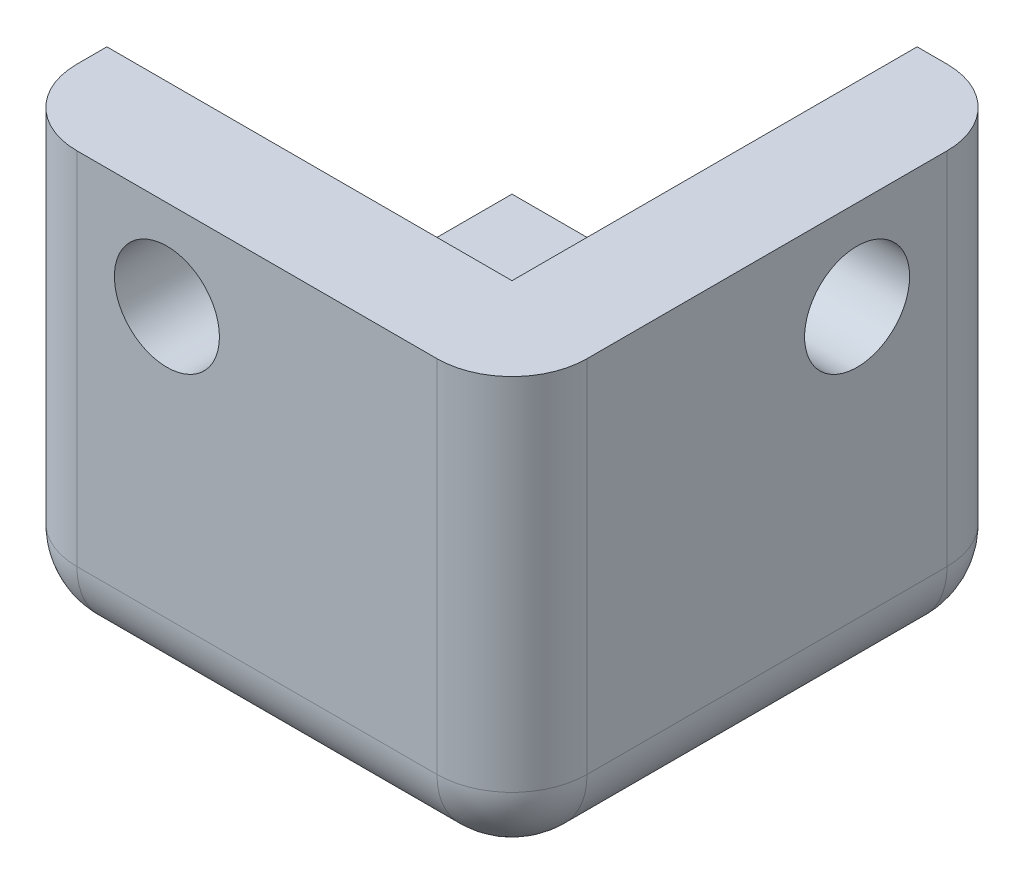
ISO-10303-21;
HEADER;
FILE_DESCRIPTION(('STEP AP214'),'2;1');
FILE_NAME('part.step','',(''),(''),'','','');
FILE_SCHEMA(('AUTOMOTIVE_DESIGN { 1 0 10303 214 1 1 1 1 }'));
ENDSEC;
DATA;
#1=APPLICATION_CONTEXT('core data for automotive mechanical design processes');
#2=APPLICATION_PROTOCOL_DEFINITION('international standard','automotive_design',2000,#1);
#3=PRODUCT_CONTEXT('',#1,'mechanical');
#4=PRODUCT('Part','Part','',(#3));
#5=PRODUCT_RELATED_PRODUCT_CATEGORY('part','',(#4));
#6=PRODUCT_DEFINITION_FORMATION('','',#4);
#7=PRODUCT_DEFINITION_CONTEXT('part definition',#1,'design');
#8=PRODUCT_DEFINITION('design','',#6,#7);
#9=PRODUCT_DEFINITION_SHAPE('','',#8);
#10=(LENGTH_UNIT() NAMED_UNIT(*) SI_UNIT(.MILLI.,.METRE.));
#11=(NAMED_UNIT(*) PLANE_ANGLE_UNIT() SI_UNIT($,.RADIAN.));
#12=(NAMED_UNIT(*) SI_UNIT($,.STERADIAN.) SOLID_ANGLE_UNIT());
#13=UNCERTAINTY_MEASURE_WITH_UNIT(LENGTH_MEASURE(1.E-05),#10,'distance_accuracy_value','');
#14=(GEOMETRIC_REPRESENTATION_CONTEXT(3) GLOBAL_UNCERTAINTY_ASSIGNED_CONTEXT((#13)) GLOBAL_UNIT_ASSIGNED_CONTEXT((#10,
#11,#12)) REPRESENTATION_CONTEXT('',''));
#15=CARTESIAN_POINT('',(0.,0.,0.));
#16=DIRECTION('',(0.,0.,1.));
#17=DIRECTION('',(1.,0.,0.));
#18=AXIS2_PLACEMENT_3D('',#15,#16,#17);
#19=CARTESIAN_POINT('',(0.,22.,0.));
#20=DIRECTION('',(1.,0.,0.));
#21=DIRECTION('',(0.,0.,-1.));
#22=AXIS2_PLACEMENT_3D('',#19,#20,#21);
#23=PLANE('',#22);
#24=DIRECTION('',(0.,1.,0.));
#25=VECTOR('',#24,1.);
#26=CARTESIAN_POINT('',(0.,-7.,-27.));
#27=LINE('',#26,#25);
#28=CARTESIAN_POINT('',(0.,-2.,-27.));
#29=VERTEX_POINT('',#28);
#30=CARTESIAN_POINT('',(0.,0.,-27.));
#31=VERTEX_POINT('',#30);
#32=EDGE_CURVE('E126',#29,#31,#27,.T.);
#33=ORIENTED_EDGE('',*,*,#32,.F.);
#34=DIRECTION('',(0.,0.,-1.));
#35=VECTOR('',#34,1.);
#36=CARTESIAN_POINT('',(0.,-2.,0.));
#37=LINE('',#36,#35);
#38=CARTESIAN_POINT('',(0.,-2.,2.));
#39=VERTEX_POINT('',#38);
#40=EDGE_CURVE('E11',#29,#39,#37,.F.);
#41=ORIENTED_EDGE('',*,*,#40,.T.);
#42=DIRECTION('',(0.,-1.,0.));
#43=VECTOR('',#42,1.);
#44=CARTESIAN_POINT('',(0.,22.,2.));
#45=LINE('',#44,#43);
#46=CARTESIAN_POINT('',(0.,22.,2.));
#47=VERTEX_POINT('',#46);
#48=EDGE_CURVE('E201',#39,#47,#45,.F.);
#49=ORIENTED_EDGE('',*,*,#48,.T.);
#50=DIRECTION('',(0.,0.,1.));
#51=VECTOR('',#50,1.);
#52=CARTESIAN_POINT('',(0.,22.,0.));
#53=LINE('',#52,#51);
#54=CARTESIAN_POINT('',(0.,22.,0.));
#55=VERTEX_POINT('',#54);
#56=EDGE_CURVE('E151',#55,#47,#53,.T.);
#57=ORIENTED_EDGE('',*,*,#56,.F.);
#58=DIRECTION('',(0.,-1.,0.));
#59=VECTOR('',#58,1.);
#60=CARTESIAN_POINT('',(0.,22.,0.));
#61=LINE('',#60,#59);
#62=CARTESIAN_POINT('',(0.,0.,0.));
#63=VERTEX_POINT('',#62);
#64=EDGE_CURVE('E141',#55,#63,#61,.T.);
#65=ORIENTED_EDGE('',*,*,#64,.T.);
#66=DIRECTION('',(0.,0.,-1.));
#67=VECTOR('',#66,1.);
#68=CARTESIAN_POINT('',(0.,0.,7.));
#69=LINE('',#68,#67);
#70=EDGE_CURVE('E138',#63,#31,#69,.T.);
#71=ORIENTED_EDGE('',*,*,#70,.T.);
#72=EDGE_LOOP('',(#33,#41,#49,#57,#65,#71));
#73=FACE_BOUND('',#72,.T.);
#74=ADVANCED_FACE('F37',(#73),#23,.F.);
#75=CARTESIAN_POINT('',(0.,22.,7.));
#76=DIRECTION('',(0.,0.,-1.));
#77=DIRECTION('',(-1.,0.,0.));
#78=AXIS2_PLACEMENT_3D('',#75,#76,#77);
#79=PLANE('',#78);
#80=CARTESIAN_POINT('',(11.,16.,7.));
#81=DIRECTION('',(0.,0.,1.));
#82=DIRECTION('',(1.,0.,0.));
#83=AXIS2_PLACEMENT_3D('',#80,#81,#82);
#84=CIRCLE('',#83,3.5);
#85=CARTESIAN_POINT('',(14.5,16.,7.));
#86=VERTEX_POINT('',#85);
#87=EDGE_CURVE('E221',#86,#86,#84,.T.);
#88=ORIENTED_EDGE('',*,*,#87,.F.);
#89=EDGE_LOOP('',(#88));
#90=FACE_BOUND('',#89,.T.);
#91=DIRECTION('',(1.,0.,0.));
#92=VECTOR('',#91,1.);
#93=CARTESIAN_POINT('',(0.,22.,7.));
#94=LINE('',#93,#92);
#95=CARTESIAN_POINT('',(5.,22.,7.));
#96=VERTEX_POINT('',#95);
#97=CARTESIAN_POINT('',(29.,22.,7.));
#98=VERTEX_POINT('',#97);
#99=EDGE_CURVE('E154',#96,#98,#94,.T.);
#100=ORIENTED_EDGE('',*,*,#99,.F.);
#101=DIRECTION('',(0.,-1.,0.));
#102=VECTOR('',#101,1.);
#103=CARTESIAN_POINT('',(5.,22.,7.));
#104=LINE('',#103,#102);
#105=CARTESIAN_POINT('',(5.,-2.,7.));
#106=VERTEX_POINT('',#105);
#107=EDGE_CURVE('E183',#96,#106,#104,.T.);
#108=ORIENTED_EDGE('',*,*,#107,.T.);
#109=DIRECTION('',(-1.,0.,0.));
#110=VECTOR('',#109,1.);
#111=CARTESIAN_POINT('',(0.,-2.,7.));
#112=LINE('',#111,#110);
#113=CARTESIAN_POINT('',(29.,-2.,7.));
#114=VERTEX_POINT('',#113);
#115=EDGE_CURVE('E181',#106,#114,#112,.F.);
#116=ORIENTED_EDGE('',*,*,#115,.T.);
#117=DIRECTION('',(0.,-1.,0.));
#118=VECTOR('',#117,1.);
#119=CARTESIAN_POINT('',(29.,22.,7.));
#120=LINE('',#119,#118);
#121=EDGE_CURVE('E179',#114,#98,#120,.F.);
#122=ORIENTED_EDGE('',*,*,#121,.T.);
#123=EDGE_LOOP('',(#100,#108,#116,#122));
#124=FACE_BOUND('',#123,.T.);
#125=ADVANCED_FACE('F265',(#90,#124),#79,.F.);
#126=CARTESIAN_POINT('',(34.,22.,7.));
#127=DIRECTION('',(-1.,0.,0.));
#128=DIRECTION('',(0.,0.,1.));
#129=AXIS2_PLACEMENT_3D('',#126,#127,#128);
#130=PLANE('',#129);
#131=CARTESIAN_POINT('',(34.,16.,-16.));
#132=DIRECTION('',(1.,0.,0.));
#133=DIRECTION('',(0.,0.,-1.));
#134=AXIS2_PLACEMENT_3D('',#131,#132,#133);
#135=CIRCLE('',#134,3.5);
#136=CARTESIAN_POINT('',(34.,16.,-19.5));
#137=VERTEX_POINT('',#136);
#138=EDGE_CURVE('E216',#137,#137,#135,.T.);
#139=ORIENTED_EDGE('',*,*,#138,.F.);
#140=EDGE_LOOP('',(#139));
#141=FACE_BOUND('',#140,.T.);
#142=DIRECTION('',(0.,0.,1.));
#143=VECTOR('',#142,1.);
#144=CARTESIAN_POINT('',(34.,-2.,7.));
#145=LINE('',#144,#143);
#146=CARTESIAN_POINT('',(34.,-2.,2.));
#147=VERTEX_POINT('',#146);
#148=CARTESIAN_POINT('',(34.,-2.,-22.));
#149=VERTEX_POINT('',#148);
#150=EDGE_CURVE('E188',#147,#149,#145,.F.);
#151=ORIENTED_EDGE('',*,*,#150,.T.);
#152=DIRECTION('',(0.,-1.,0.));
#153=VECTOR('',#152,1.);
#154=CARTESIAN_POINT('',(34.,22.,-22.));
#155=LINE('',#154,#153);
#156=CARTESIAN_POINT('',(34.,22.,-22.));
#157=VERTEX_POINT('',#156);
#158=EDGE_CURVE('E191',#149,#157,#155,.F.);
#159=ORIENTED_EDGE('',*,*,#158,.T.);
#160=DIRECTION('',(0.,0.,-1.));
#161=VECTOR('',#160,1.);
#162=CARTESIAN_POINT('',(34.,22.,7.));
#163=LINE('',#162,#161);
#164=CARTESIAN_POINT('',(34.,22.,2.));
#165=VERTEX_POINT('',#164);
#166=EDGE_CURVE('E158',#165,#157,#163,.T.);
#167=ORIENTED_EDGE('',*,*,#166,.F.);
#168=DIRECTION('',(0.,-1.,0.));
#169=VECTOR('',#168,1.);
#170=CARTESIAN_POINT('',(34.,22.,2.));
#171=LINE('',#170,#169);
#172=EDGE_CURVE('E186',#165,#147,#171,.T.);
#173=ORIENTED_EDGE('',*,*,#172,.T.);
#174=EDGE_LOOP('',(#151,#159,#167,#173));
#175=FACE_BOUND('',#174,.T.);
#176=ADVANCED_FACE('F262',(#141,#175),#130,.F.);
#177=CARTESIAN_POINT('',(27.,22.,-27.));
#178=DIRECTION('',(0.,0.,1.));
#179=DIRECTION('',(1.,0.,0.));
#180=AXIS2_PLACEMENT_3D('',#177,#178,#179);
#181=PLANE('',#180);
#182=DIRECTION('',(0.,-1.,0.));
#183=VECTOR('',#182,1.);
#184=CARTESIAN_POINT('',(29.,22.,-27.));
#185=LINE('',#184,#183);
#186=CARTESIAN_POINT('',(29.,22.,-27.));
#187=VERTEX_POINT('',#186);
#188=CARTESIAN_POINT('',(29.,-2.,-27.));
#189=VERTEX_POINT('',#188);
#190=EDGE_CURVE('E193',#187,#189,#185,.T.);
#191=ORIENTED_EDGE('',*,*,#190,.T.);
#192=DIRECTION('',(1.,0.,0.));
#193=VECTOR('',#192,1.);
#194=CARTESIAN_POINT('',(27.,-2.,-27.));
#195=LINE('',#194,#193);
#196=EDGE_CURVE('E46',#189,#29,#195,.F.);
#197=ORIENTED_EDGE('',*,*,#196,.T.);
#198=ORIENTED_EDGE('',*,*,#32,.T.);
#199=DIRECTION('',(1.,0.,0.));
#200=VECTOR('',#199,1.);
#201=CARTESIAN_POINT('',(34.,0.,-27.));
#202=LINE('',#201,#200);
#203=CARTESIAN_POINT('',(27.,0.,-27.));
#204=VERTEX_POINT('',#203);
#205=EDGE_CURVE('E131',#31,#204,#202,.T.);
#206=ORIENTED_EDGE('',*,*,#205,.T.);
#207=DIRECTION('',(0.,-1.,0.));
#208=VECTOR('',#207,1.);
#209=CARTESIAN_POINT('',(27.,22.,-27.));
#210=LINE('',#209,#208);
#211=CARTESIAN_POINT('',(27.,22.,-27.));
#212=VERTEX_POINT('',#211);
#213=EDGE_CURVE('E173',#212,#204,#210,.T.);
#214=ORIENTED_EDGE('',*,*,#213,.F.);
#215=DIRECTION('',(-1.,0.,0.));
#216=VECTOR('',#215,1.);
#217=CARTESIAN_POINT('',(27.,22.,-27.));
#218=LINE('',#217,#216);
#219=EDGE_CURVE('E161',#187,#212,#218,.T.);
#220=ORIENTED_EDGE('',*,*,#219,.F.);
#221=EDGE_LOOP('',(#191,#197,#198,#206,#214,#220));
#222=FACE_BOUND('',#221,.T.);
#223=ADVANCED_FACE('F128',(#222),#181,.F.);
#224=CARTESIAN_POINT('',(27.,22.,0.));
#225=DIRECTION('',(1.,0.,0.));
#226=DIRECTION('',(0.,0.,-1.));
#227=AXIS2_PLACEMENT_3D('',#224,#225,#226);
#228=PLANE('',#227);
#229=CARTESIAN_POINT('',(27.,16.,-16.));
#230=DIRECTION('',(1.,0.,0.));
#231=DIRECTION('',(0.,0.,-1.));
#232=AXIS2_PLACEMENT_3D('',#229,#230,#231);
#233=CIRCLE('',#232,2.);
#234=CARTESIAN_POINT('',(27.,16.,-18.));
#235=VERTEX_POINT('',#234);
#236=EDGE_CURVE('E213',#235,#235,#233,.T.);
#237=ORIENTED_EDGE('',*,*,#236,.T.);
#238=EDGE_LOOP('',(#237));
#239=FACE_BOUND('',#238,.T.);
#240=DIRECTION('',(0.,0.,1.));
#241=VECTOR('',#240,1.);
#242=CARTESIAN_POINT('',(27.,0.,0.));
#243=LINE('',#242,#241);
#244=CARTESIAN_POINT('',(27.,0.,0.));
#245=VERTEX_POINT('',#244);
#246=EDGE_CURVE('E135',#204,#245,#243,.T.);
#247=ORIENTED_EDGE('',*,*,#246,.T.);
#248=DIRECTION('',(0.,-1.,0.));
#249=VECTOR('',#248,1.);
#250=CARTESIAN_POINT('',(27.,22.,0.));
#251=LINE('',#250,#249);
#252=CARTESIAN_POINT('',(27.,22.,0.));
#253=VERTEX_POINT('',#252);
#254=EDGE_CURVE('E170',#253,#245,#251,.T.);
#255=ORIENTED_EDGE('',*,*,#254,.F.);
#256=DIRECTION('',(0.,0.,1.));
#257=VECTOR('',#256,1.);
#258=CARTESIAN_POINT('',(27.,22.,0.));
#259=LINE('',#258,#257);
#260=EDGE_CURVE('E163',#212,#253,#259,.T.);
#261=ORIENTED_EDGE('',*,*,#260,.F.);
#262=ORIENTED_EDGE('',*,*,#213,.T.);
#263=EDGE_LOOP('',(#247,#255,#261,#262));
#264=FACE_BOUND('',#263,.T.);
#265=ADVANCED_FACE('F284',(#239,#264),#228,.F.);
#266=CARTESIAN_POINT('',(0.,22.,0.));
#267=DIRECTION('',(0.,0.,1.));
#268=DIRECTION('',(1.,0.,0.));
#269=AXIS2_PLACEMENT_3D('',#266,#267,#268);
#270=PLANE('',#269);
#271=CARTESIAN_POINT('',(11.,16.,0.));
#272=DIRECTION('',(0.,0.,1.));
#273=DIRECTION('',(1.,0.,0.));
#274=AXIS2_PLACEMENT_3D('',#271,#272,#273);
#275=CIRCLE('',#274,2.);
#276=CARTESIAN_POINT('',(13.,16.,0.));
#277=VERTEX_POINT('',#276);
#278=EDGE_CURVE('E218',#277,#277,#275,.T.);
#279=ORIENTED_EDGE('',*,*,#278,.T.);
#280=EDGE_LOOP('',(#279));
#281=FACE_BOUND('',#280,.T.);
#282=DIRECTION('',(-1.,0.,0.));
#283=VECTOR('',#282,1.);
#284=CARTESIAN_POINT('',(0.,0.,0.));
#285=LINE('',#284,#283);
#286=EDGE_CURVE('E155',#245,#63,#285,.T.);
#287=ORIENTED_EDGE('',*,*,#286,.T.);
#288=ORIENTED_EDGE('',*,*,#64,.F.);
#289=DIRECTION('',(-1.,0.,0.));
#290=VECTOR('',#289,1.);
#291=CARTESIAN_POINT('',(0.,22.,0.));
#292=LINE('',#291,#290);
#293=EDGE_CURVE('E165',#253,#55,#292,.T.);
#294=ORIENTED_EDGE('',*,*,#293,.F.);
#295=ORIENTED_EDGE('',*,*,#254,.T.);
#296=EDGE_LOOP('',(#287,#288,#294,#295));
#297=FACE_BOUND('',#296,.T.);
#298=ADVANCED_FACE('F288',(#281,#297),#270,.F.);
#299=CARTESIAN_POINT('',(0.,22.,0.));
#300=DIRECTION('',(0.,1.,0.));
#301=DIRECTION('',(0.,0.,1.));
#302=AXIS2_PLACEMENT_3D('',#299,#300,#301);
#303=PLANE('',#302);
#304=ORIENTED_EDGE('',*,*,#166,.T.);
#305=CARTESIAN_POINT('',(29.,22.,-22.));
#306=DIRECTION('',(0.,1.,0.));
#307=DIRECTION('',(0.,0.,1.));
#308=AXIS2_PLACEMENT_3D('',#305,#306,#307);
#309=CIRCLE('',#308,5.);
#310=EDGE_CURVE('E199',#157,#187,#309,.T.);
#311=ORIENTED_EDGE('',*,*,#310,.T.);
#312=ORIENTED_EDGE('',*,*,#219,.T.);
#313=ORIENTED_EDGE('',*,*,#260,.T.);
#314=ORIENTED_EDGE('',*,*,#293,.T.);
#315=ORIENTED_EDGE('',*,*,#56,.T.);
#316=CARTESIAN_POINT('',(5.,22.,2.));
#317=DIRECTION('',(0.,1.,0.));
#318=DIRECTION('',(0.,0.,1.));
#319=AXIS2_PLACEMENT_3D('',#316,#317,#318);
#320=CIRCLE('',#319,5.);
#321=EDGE_CURVE('E197',#47,#96,#320,.T.);
#322=ORIENTED_EDGE('',*,*,#321,.T.);
#323=ORIENTED_EDGE('',*,*,#99,.T.);
#324=CARTESIAN_POINT('',(29.,22.,2.));
#325=DIRECTION('',(0.,1.,0.));
#326=DIRECTION('',(0.,0.,1.));
#327=AXIS2_PLACEMENT_3D('',#324,#325,#326);
#328=CIRCLE('',#327,5.);
#329=EDGE_CURVE('E195',#98,#165,#328,.T.);
#330=ORIENTED_EDGE('',*,*,#329,.T.);
#331=EDGE_LOOP('',(#304,#311,#312,#313,#314,#315,#322,#323,#330));
#332=FACE_BOUND('',#331,.T.);
#333=ADVANCED_FACE('F280',(#332),#303,.T.);
#334=CARTESIAN_POINT('',(0.,0.,0.));
#335=DIRECTION('',(0.,1.,0.));
#336=DIRECTION('',(0.,0.,1.));
#337=AXIS2_PLACEMENT_3D('',#334,#335,#336);
#338=PLANE('',#337);
#339=ORIENTED_EDGE('',*,*,#286,.F.);
#340=ORIENTED_EDGE('',*,*,#246,.F.);
#341=ORIENTED_EDGE('',*,*,#205,.F.);
#342=ORIENTED_EDGE('',*,*,#70,.F.);
#343=EDGE_LOOP('',(#339,#340,#341,#342));
#344=FACE_BOUND('',#343,.T.);
#345=ADVANCED_FACE('F146',(#344),#338,.T.);
#346=CARTESIAN_POINT('',(0.,-7.,0.));
#347=DIRECTION('',(0.,1.,0.));
#348=DIRECTION('',(0.,0.,1.));
#349=AXIS2_PLACEMENT_3D('',#346,#347,#348);
#350=PLANE('',#349);
#351=DIRECTION('',(0.,0.,-1.));
#352=VECTOR('',#351,1.);
#353=CARTESIAN_POINT('',(5.,-7.,0.));
#354=LINE('',#353,#352);
#355=CARTESIAN_POINT('',(5.,-7.,2.));
#356=VERTEX_POINT('',#355);
#357=CARTESIAN_POINT('',(5.,-7.,-22.));
#358=VERTEX_POINT('',#357);
#359=EDGE_CURVE('E61',#356,#358,#354,.T.);
#360=ORIENTED_EDGE('',*,*,#359,.T.);
#361=DIRECTION('',(1.,0.,0.));
#362=VECTOR('',#361,1.);
#363=CARTESIAN_POINT('',(0.,-7.,-22.));
#364=LINE('',#363,#362);
#365=CARTESIAN_POINT('',(29.,-7.,-22.));
#366=VERTEX_POINT('',#365);
#367=EDGE_CURVE('E232',#358,#366,#364,.T.);
#368=ORIENTED_EDGE('',*,*,#367,.T.);
#369=DIRECTION('',(0.,0.,1.));
#370=VECTOR('',#369,1.);
#371=CARTESIAN_POINT('',(29.,-7.,0.));
#372=LINE('',#371,#370);
#373=CARTESIAN_POINT('',(29.,-7.,2.));
#374=VERTEX_POINT('',#373);
#375=EDGE_CURVE('E175',#366,#374,#372,.T.);
#376=ORIENTED_EDGE('',*,*,#375,.T.);
#377=DIRECTION('',(-1.,0.,0.));
#378=VECTOR('',#377,1.);
#379=CARTESIAN_POINT('',(0.,-7.,2.));
#380=LINE('',#379,#378);
#381=EDGE_CURVE('E177',#374,#356,#380,.T.);
#382=ORIENTED_EDGE('',*,*,#381,.T.);
#383=EDGE_LOOP('',(#360,#368,#376,#382));
#384=FACE_BOUND('',#383,.T.);
#385=ADVANCED_FACE('F300',(#384),#350,.F.);
#386=CARTESIAN_POINT('',(29.,22.,-22.));
#387=DIRECTION('',(0.,-1.,0.));
#388=DIRECTION('',(0.,0.,-1.));
#389=AXIS2_PLACEMENT_3D('',#386,#387,#388);
#390=CYLINDRICAL_SURFACE('',#389,5.);
#391=ORIENTED_EDGE('',*,*,#158,.F.);
#392=CARTESIAN_POINT('',(29.,-2.,-22.));
#393=DIRECTION('',(0.,-1.,0.));
#394=DIRECTION('',(0.,0.,-1.));
#395=AXIS2_PLACEMENT_3D('',#392,#393,#394);
#396=CIRCLE('',#395,5.);
#397=EDGE_CURVE('E225',#149,#189,#396,.F.);
#398=ORIENTED_EDGE('',*,*,#397,.T.);
#399=ORIENTED_EDGE('',*,*,#190,.F.);
#400=ORIENTED_EDGE('',*,*,#310,.F.);
#401=EDGE_LOOP('',(#391,#398,#399,#400));
#402=FACE_BOUND('',#401,.T.);
#403=ADVANCED_FACE('F276',(#402),#390,.T.);
#404=CARTESIAN_POINT('',(29.,22.,2.));
#405=DIRECTION('',(0.,-1.,0.));
#406=DIRECTION('',(0.,0.,-1.));
#407=AXIS2_PLACEMENT_3D('',#404,#405,#406);
#408=CYLINDRICAL_SURFACE('',#407,5.);
#409=ORIENTED_EDGE('',*,*,#329,.F.);
#410=ORIENTED_EDGE('',*,*,#121,.F.);
#411=CARTESIAN_POINT('',(29.,-2.,2.));
#412=DIRECTION('',(0.,-1.,0.));
#413=DIRECTION('',(0.,0.,-1.));
#414=AXIS2_PLACEMENT_3D('',#411,#412,#413);
#415=CIRCLE('',#414,5.);
#416=EDGE_CURVE('E144',#147,#114,#415,.T.);
#417=ORIENTED_EDGE('',*,*,#416,.F.);
#418=ORIENTED_EDGE('',*,*,#172,.F.);
#419=EDGE_LOOP('',(#409,#410,#417,#418));
#420=FACE_BOUND('',#419,.T.);
#421=ADVANCED_FACE('F310',(#420),#408,.T.);
#422=CARTESIAN_POINT('',(29.,-2.,0.));
#423=DIRECTION('',(0.,0.,1.));
#424=DIRECTION('',(1.,0.,0.));
#425=AXIS2_PLACEMENT_3D('',#422,#423,#424);
#426=CYLINDRICAL_SURFACE('',#425,5.);
#427=ORIENTED_EDGE('',*,*,#375,.F.);
#428=CARTESIAN_POINT('',(29.,-2.,-22.));
#429=DIRECTION('',(0.,0.,1.));
#430=DIRECTION('',(1.,0.,0.));
#431=AXIS2_PLACEMENT_3D('',#428,#429,#430);
#432=CIRCLE('',#431,5.);
#433=EDGE_CURVE('E203',#366,#149,#432,.T.);
#434=ORIENTED_EDGE('',*,*,#433,.T.);
#435=ORIENTED_EDGE('',*,*,#150,.F.);
#436=CARTESIAN_POINT('',(29.,-2.,2.));
#437=DIRECTION('',(0.,0.,1.));
#438=DIRECTION('',(1.,0.,0.));
#439=AXIS2_PLACEMENT_3D('',#436,#437,#438);
#440=CIRCLE('',#439,5.);
#441=EDGE_CURVE('E207',#374,#147,#440,.T.);
#442=ORIENTED_EDGE('',*,*,#441,.F.);
#443=EDGE_LOOP('',(#427,#434,#435,#442));
#444=FACE_BOUND('',#443,.T.);
#445=ADVANCED_FACE('F304',(#444),#426,.T.);
#446=CARTESIAN_POINT('',(29.,-2.,2.));
#447=DIRECTION('',(0.,0.,1.));
#448=DIRECTION('',(1.,0.,0.));
#449=AXIS2_PLACEMENT_3D('',#446,#447,#448);
#450=SPHERICAL_SURFACE('',#449,5.);
#451=ORIENTED_EDGE('',*,*,#441,.T.);
#452=ORIENTED_EDGE('',*,*,#416,.T.);
#453=CARTESIAN_POINT('',(29.,-2.,2.));
#454=DIRECTION('',(1.,0.,0.));
#455=DIRECTION('',(0.,0.,-1.));
#456=AXIS2_PLACEMENT_3D('',#453,#454,#455);
#457=CIRCLE('',#456,5.);
#458=EDGE_CURVE('E204',#374,#114,#457,.F.);
#459=ORIENTED_EDGE('',*,*,#458,.F.);
#460=EDGE_LOOP('',(#451,#452,#459));
#461=FACE_BOUND('',#460,.T.);
#462=ADVANCED_FACE('F306',(#461),#450,.T.);
#463=CARTESIAN_POINT('',(5.,22.,2.));
#464=DIRECTION('',(0.,-1.,0.));
#465=DIRECTION('',(0.,0.,-1.));
#466=AXIS2_PLACEMENT_3D('',#463,#464,#465);
#467=CYLINDRICAL_SURFACE('',#466,5.);
#468=ORIENTED_EDGE('',*,*,#48,.F.);
#469=CARTESIAN_POINT('',(5.,-2.,2.));
#470=DIRECTION('',(0.,-1.,0.));
#471=DIRECTION('',(0.,0.,-1.));
#472=AXIS2_PLACEMENT_3D('',#469,#470,#471);
#473=CIRCLE('',#472,5.);
#474=EDGE_CURVE('E229',#39,#106,#473,.F.);
#475=ORIENTED_EDGE('',*,*,#474,.T.);
#476=ORIENTED_EDGE('',*,*,#107,.F.);
#477=ORIENTED_EDGE('',*,*,#321,.F.);
#478=EDGE_LOOP('',(#468,#475,#476,#477));
#479=FACE_BOUND('',#478,.T.);
#480=ADVANCED_FACE('F292',(#479),#467,.T.);
#481=CARTESIAN_POINT('',(0.,-2.,2.));
#482=DIRECTION('',(-1.,0.,0.));
#483=DIRECTION('',(0.,0.,1.));
#484=AXIS2_PLACEMENT_3D('',#481,#482,#483);
#485=CYLINDRICAL_SURFACE('',#484,5.);
#486=ORIENTED_EDGE('',*,*,#115,.F.);
#487=CARTESIAN_POINT('',(5.,-2.,2.));
#488=DIRECTION('',(-1.,0.,0.));
#489=DIRECTION('',(0.,0.,1.));
#490=AXIS2_PLACEMENT_3D('',#487,#488,#489);
#491=CIRCLE('',#490,5.);
#492=EDGE_CURVE('E227',#106,#356,#491,.F.);
#493=ORIENTED_EDGE('',*,*,#492,.T.);
#494=ORIENTED_EDGE('',*,*,#381,.F.);
#495=ORIENTED_EDGE('',*,*,#458,.T.);
#496=EDGE_LOOP('',(#486,#493,#494,#495));
#497=FACE_BOUND('',#496,.T.);
#498=ADVANCED_FACE('F299',(#497),#485,.T.);
#499=CARTESIAN_POINT('',(29.,16.,-16.));
#500=DIRECTION('',(1.,0.,0.));
#501=DIRECTION('',(0.,0.,-1.));
#502=AXIS2_PLACEMENT_3D('',#499,#500,#501);
#503=CYLINDRICAL_SURFACE('',#502,3.5);
#504=CARTESIAN_POINT('',(29.,16.,-16.));
#505=DIRECTION('',(1.,0.,0.));
#506=DIRECTION('',(0.,0.,-1.));
#507=AXIS2_PLACEMENT_3D('',#504,#505,#506);
#508=CIRCLE('',#507,3.5);
#509=CARTESIAN_POINT('',(29.,16.,-19.5));
#510=VERTEX_POINT('',#509);
#511=EDGE_CURVE('E208',#510,#510,#508,.T.);
#512=ORIENTED_EDGE('',*,*,#511,.F.);
#513=EDGE_LOOP('',(#512));
#514=FACE_BOUND('',#513,.T.);
#515=ORIENTED_EDGE('',*,*,#138,.T.);
#516=EDGE_LOOP('',(#515));
#517=FACE_BOUND('',#516,.T.);
#518=ADVANCED_FACE('F260',(#514,#517),#503,.F.);
#519=CARTESIAN_POINT('',(29.,16.,-16.));
#520=DIRECTION('',(1.,0.,0.));
#521=DIRECTION('',(0.,0.,-1.));
#522=AXIS2_PLACEMENT_3D('',#519,#520,#521);
#523=PLANE('',#522);
#524=CARTESIAN_POINT('',(29.,16.,-16.));
#525=DIRECTION('',(1.,0.,0.));
#526=DIRECTION('',(0.,0.,-1.));
#527=AXIS2_PLACEMENT_3D('',#524,#525,#526);
#528=CIRCLE('',#527,2.);
#529=CARTESIAN_POINT('',(29.,16.,-18.));
#530=VERTEX_POINT('',#529);
#531=EDGE_CURVE('E217',#530,#530,#528,.T.);
#532=ORIENTED_EDGE('',*,*,#531,.F.);
#533=EDGE_LOOP('',(#532));
#534=FACE_BOUND('',#533,.T.);
#535=ORIENTED_EDGE('',*,*,#511,.T.);
#536=EDGE_LOOP('',(#535));
#537=FACE_BOUND('',#536,.T.);
#538=ADVANCED_FACE('F366',(#534,#537),#523,.T.);
#539=CARTESIAN_POINT('',(24.,16.,-16.));
#540=DIRECTION('',(1.,0.,0.));
#541=DIRECTION('',(0.,0.,-1.));
#542=AXIS2_PLACEMENT_3D('',#539,#540,#541);
#543=CYLINDRICAL_SURFACE('',#542,2.);
#544=ORIENTED_EDGE('',*,*,#531,.T.);
#545=EDGE_LOOP('',(#544));
#546=FACE_BOUND('',#545,.T.);
#547=ORIENTED_EDGE('',*,*,#236,.F.);
#548=EDGE_LOOP('',(#547));
#549=FACE_BOUND('',#548,.T.);
#550=ADVANCED_FACE('F362',(#546,#549),#543,.F.);
#551=CARTESIAN_POINT('',(11.,16.,2.));
#552=DIRECTION('',(0.,0.,1.));
#553=DIRECTION('',(1.,0.,0.));
#554=AXIS2_PLACEMENT_3D('',#551,#552,#553);
#555=CYLINDRICAL_SURFACE('',#554,3.5);
#556=CARTESIAN_POINT('',(11.,16.,2.));
#557=DIRECTION('',(0.,0.,1.));
#558=DIRECTION('',(1.,0.,0.));
#559=AXIS2_PLACEMENT_3D('',#556,#557,#558);
#560=CIRCLE('',#559,3.5);
#561=CARTESIAN_POINT('',(14.5,16.,2.));
#562=VERTEX_POINT('',#561);
#563=EDGE_CURVE('E249',#562,#562,#560,.T.);
#564=ORIENTED_EDGE('',*,*,#563,.F.);
#565=EDGE_LOOP('',(#564));
#566=FACE_BOUND('',#565,.T.);
#567=ORIENTED_EDGE('',*,*,#87,.T.);
#568=EDGE_LOOP('',(#567));
#569=FACE_BOUND('',#568,.T.);
#570=ADVANCED_FACE('F355',(#566,#569),#555,.F.);
#571=CARTESIAN_POINT('',(11.,16.,2.));
#572=DIRECTION('',(0.,0.,1.));
#573=DIRECTION('',(1.,0.,0.));
#574=AXIS2_PLACEMENT_3D('',#571,#572,#573);
#575=PLANE('',#574);
#576=CARTESIAN_POINT('',(11.,16.,2.));
#577=DIRECTION('',(0.,0.,1.));
#578=DIRECTION('',(1.,0.,0.));
#579=AXIS2_PLACEMENT_3D('',#576,#577,#578);
#580=CIRCLE('',#579,2.);
#581=CARTESIAN_POINT('',(13.,16.,2.));
#582=VERTEX_POINT('',#581);
#583=EDGE_CURVE('E222',#582,#582,#580,.T.);
#584=ORIENTED_EDGE('',*,*,#583,.F.);
#585=EDGE_LOOP('',(#584));
#586=FACE_BOUND('',#585,.T.);
#587=ORIENTED_EDGE('',*,*,#563,.T.);
#588=EDGE_LOOP('',(#587));
#589=FACE_BOUND('',#588,.T.);
#590=ADVANCED_FACE('F350',(#586,#589),#575,.T.);
#591=CARTESIAN_POINT('',(11.,16.,-3.));
#592=DIRECTION('',(0.,0.,1.));
#593=DIRECTION('',(1.,0.,0.));
#594=AXIS2_PLACEMENT_3D('',#591,#592,#593);
#595=CYLINDRICAL_SURFACE('',#594,2.);
#596=ORIENTED_EDGE('',*,*,#583,.T.);
#597=EDGE_LOOP('',(#596));
#598=FACE_BOUND('',#597,.T.);
#599=ORIENTED_EDGE('',*,*,#278,.F.);
#600=EDGE_LOOP('',(#599));
#601=FACE_BOUND('',#600,.T.);
#602=ADVANCED_FACE('F346',(#598,#601),#595,.F.);
#603=CARTESIAN_POINT('',(5.,-2.,2.));
#604=DIRECTION('',(0.,0.,1.));
#605=DIRECTION('',(1.,0.,0.));
#606=AXIS2_PLACEMENT_3D('',#603,#604,#605);
#607=SPHERICAL_SURFACE('',#606,5.);
#608=ORIENTED_EDGE('',*,*,#492,.F.);
#609=ORIENTED_EDGE('',*,*,#474,.F.);
#610=CARTESIAN_POINT('',(5.,-2.,2.));
#611=DIRECTION('',(0.,0.,-1.));
#612=DIRECTION('',(-1.,0.,0.));
#613=AXIS2_PLACEMENT_3D('',#610,#611,#612);
#614=CIRCLE('',#613,5.);
#615=EDGE_CURVE('E41',#356,#39,#614,.T.);
#616=ORIENTED_EDGE('',*,*,#615,.F.);
#617=EDGE_LOOP('',(#608,#609,#616));
#618=FACE_BOUND('',#617,.T.);
#619=ADVANCED_FACE('F39',(#618),#607,.T.);
#620=CARTESIAN_POINT('',(5.,-2.,0.));
#621=DIRECTION('',(0.,0.,-1.));
#622=DIRECTION('',(-1.,0.,0.));
#623=AXIS2_PLACEMENT_3D('',#620,#621,#622);
#624=CYLINDRICAL_SURFACE('',#623,5.);
#625=ORIENTED_EDGE('',*,*,#615,.T.);
#626=ORIENTED_EDGE('',*,*,#40,.F.);
#627=CARTESIAN_POINT('',(5.,-2.,-22.));
#628=DIRECTION('',(0.707106781186547,0.,-0.707106781186547));
#629=DIRECTION('',(-0.707106781186547,0.,-0.707106781186547));
#630=AXIS2_PLACEMENT_3D('',#627,#628,#629);
#631=ELLIPSE('',#630,7.07106781186547,5.);
#632=EDGE_CURVE('E237',#358,#29,#631,.T.);
#633=ORIENTED_EDGE('',*,*,#632,.F.);
#634=ORIENTED_EDGE('',*,*,#359,.F.);
#635=EDGE_LOOP('',(#625,#626,#633,#634));
#636=FACE_BOUND('',#635,.T.);
#637=ADVANCED_FACE('F341',(#636),#624,.T.);
#638=CARTESIAN_POINT('',(0.,-2.,-22.));
#639=DIRECTION('',(1.,0.,0.));
#640=DIRECTION('',(0.,0.,-1.));
#641=AXIS2_PLACEMENT_3D('',#638,#639,#640);
#642=CYLINDRICAL_SURFACE('',#641,5.);
#643=ORIENTED_EDGE('',*,*,#632,.T.);
#644=ORIENTED_EDGE('',*,*,#196,.F.);
#645=CARTESIAN_POINT('',(29.,-2.,-22.));
#646=DIRECTION('',(1.,0.,0.));
#647=DIRECTION('',(0.,0.,-1.));
#648=AXIS2_PLACEMENT_3D('',#645,#646,#647);
#649=CIRCLE('',#648,5.);
#650=EDGE_CURVE('E235',#366,#189,#649,.T.);
#651=ORIENTED_EDGE('',*,*,#650,.F.);
#652=ORIENTED_EDGE('',*,*,#367,.F.);
#653=EDGE_LOOP('',(#643,#644,#651,#652));
#654=FACE_BOUND('',#653,.T.);
#655=ADVANCED_FACE('F338',(#654),#642,.T.);
#656=CARTESIAN_POINT('',(29.,-2.,-22.));
#657=DIRECTION('',(0.,0.,1.));
#658=DIRECTION('',(1.,0.,0.));
#659=AXIS2_PLACEMENT_3D('',#656,#657,#658);
#660=SPHERICAL_SURFACE('',#659,5.);
#661=ORIENTED_EDGE('',*,*,#650,.T.);
#662=ORIENTED_EDGE('',*,*,#397,.F.);
#663=ORIENTED_EDGE('',*,*,#433,.F.);
#664=EDGE_LOOP('',(#661,#662,#663));
#665=FACE_BOUND('',#664,.T.);
#666=ADVANCED_FACE('F335',(#665),#660,.T.);
#667=CLOSED_SHELL('',(#74,#125,#176,#223,#265,#298,#333,#345,#385,#403,#421,#445,#462,#480,#498,
#518,#538,#550,#570,#590,#602,#619,#637,#655,#666));
#668=MANIFOLD_SOLID_BREP('B2',#667);
#669=ADVANCED_BREP_SHAPE_REPRESENTATION('',(#18,#668),#14);
#670=SHAPE_DEFINITION_REPRESENTATION(#9,#669);
ENDSEC;
END-ISO-10303-21;
